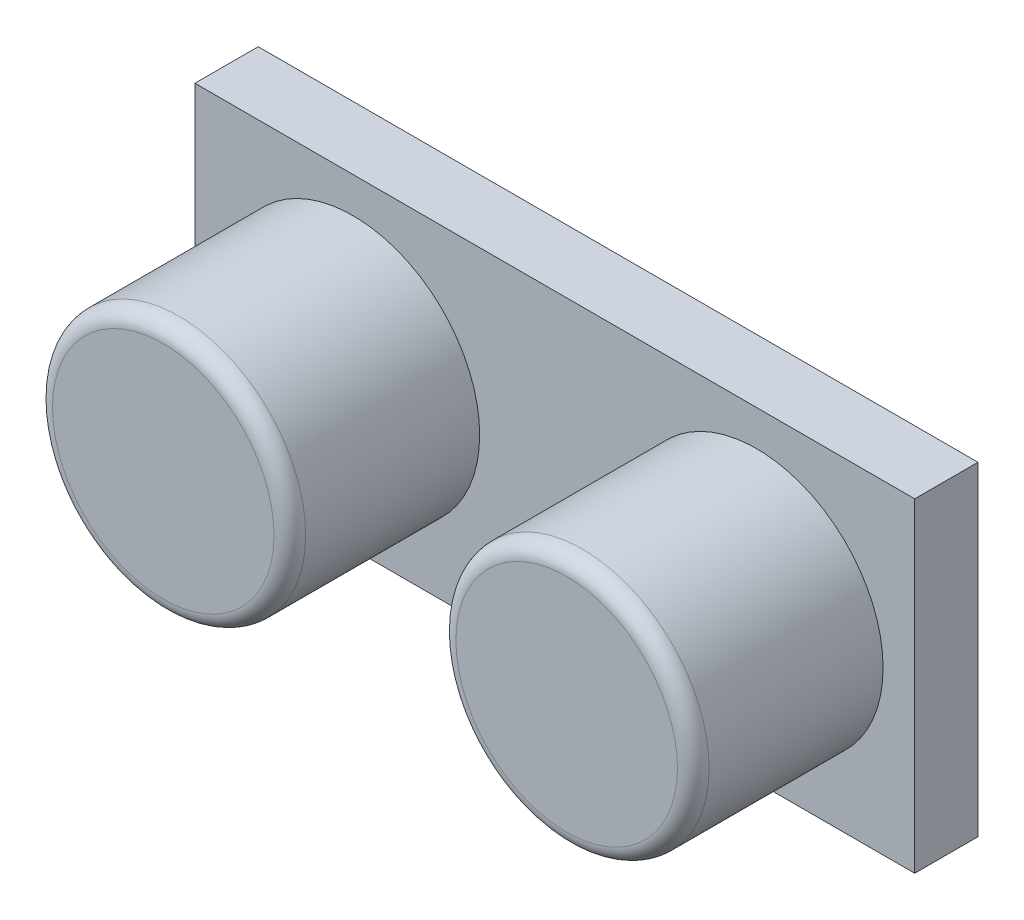
ISO-10303-21;
HEADER;
FILE_DESCRIPTION(('STEP AP214'),'2;1');
FILE_NAME('part.step','',(''),(''),'','','');
FILE_SCHEMA(('AUTOMOTIVE_DESIGN { 1 0 10303 214 1 1 1 1 }'));
ENDSEC;
DATA;
#1=APPLICATION_CONTEXT('core data for automotive mechanical design processes');
#2=APPLICATION_PROTOCOL_DEFINITION('international standard','automotive_design',2000,#1);
#3=PRODUCT_CONTEXT('',#1,'mechanical');
#4=PRODUCT('Part','Part','',(#3));
#5=PRODUCT_RELATED_PRODUCT_CATEGORY('part','',(#4));
#6=PRODUCT_DEFINITION_FORMATION('','',#4);
#7=PRODUCT_DEFINITION_CONTEXT('part definition',#1,'design');
#8=PRODUCT_DEFINITION('design','',#6,#7);
#9=PRODUCT_DEFINITION_SHAPE('','',#8);
#10=(LENGTH_UNIT() NAMED_UNIT(*) SI_UNIT(.MILLI.,.METRE.));
#11=(NAMED_UNIT(*) PLANE_ANGLE_UNIT() SI_UNIT($,.RADIAN.));
#12=(NAMED_UNIT(*) SI_UNIT($,.STERADIAN.) SOLID_ANGLE_UNIT());
#13=UNCERTAINTY_MEASURE_WITH_UNIT(LENGTH_MEASURE(1.E-05),#10,'distance_accuracy_value','');
#14=(GEOMETRIC_REPRESENTATION_CONTEXT(3) GLOBAL_UNCERTAINTY_ASSIGNED_CONTEXT((#13)) GLOBAL_UNIT_ASSIGNED_CONTEXT((#10,
#11,#12)) REPRESENTATION_CONTEXT('',''));
#15=CARTESIAN_POINT('',(0.,0.,0.));
#16=DIRECTION('',(0.,0.,1.));
#17=DIRECTION('',(1.,0.,0.));
#18=AXIS2_PLACEMENT_3D('',#15,#16,#17);
#19=CARTESIAN_POINT('',(0.,0.,4.));
#20=DIRECTION('',(0.,0.,-1.));
#21=DIRECTION('',(-1.,0.,0.));
#22=AXIS2_PLACEMENT_3D('',#19,#20,#21);
#23=PLANE('',#22);
#24=CARTESIAN_POINT('',(-12.75,0.,4.));
#25=DIRECTION('',(0.,0.,-1.));
#26=DIRECTION('',(-1.,0.,0.));
#27=AXIS2_PLACEMENT_3D('',#24,#25,#26);
#28=CIRCLE('',#27,8.);
#29=CARTESIAN_POINT('',(-20.75,0.,4.));
#30=VERTEX_POINT('',#29);
#31=EDGE_CURVE('E109',#30,#30,#28,.F.);
#32=ORIENTED_EDGE('',*,*,#31,.F.);
#33=EDGE_LOOP('',(#32));
#34=FACE_BOUND('',#33,.T.);
#35=DIRECTION('',(0.,1.,0.));
#36=VECTOR('',#35,1.);
#37=CARTESIAN_POINT('',(22.75,-10.25,4.));
#38=LINE('',#37,#36);
#39=CARTESIAN_POINT('',(22.75,-10.25,4.));
#40=VERTEX_POINT('',#39);
#41=CARTESIAN_POINT('',(22.75,10.25,4.));
#42=VERTEX_POINT('',#41);
#43=EDGE_CURVE('E85',#40,#42,#38,.T.);
#44=ORIENTED_EDGE('',*,*,#43,.T.);
#45=DIRECTION('',(-1.,0.,0.));
#46=VECTOR('',#45,1.);
#47=CARTESIAN_POINT('',(-22.75,10.25,4.));
#48=LINE('',#47,#46);
#49=CARTESIAN_POINT('',(-22.75,10.25,4.));
#50=VERTEX_POINT('',#49);
#51=EDGE_CURVE('E80',#42,#50,#48,.T.);
#52=ORIENTED_EDGE('',*,*,#51,.T.);
#53=DIRECTION('',(0.,-1.,0.));
#54=VECTOR('',#53,1.);
#55=CARTESIAN_POINT('',(-22.75,-10.25,4.));
#56=LINE('',#55,#54);
#57=CARTESIAN_POINT('',(-22.75,-10.25,4.));
#58=VERTEX_POINT('',#57);
#59=EDGE_CURVE('E83',#50,#58,#56,.T.);
#60=ORIENTED_EDGE('',*,*,#59,.T.);
#61=DIRECTION('',(1.,0.,0.));
#62=VECTOR('',#61,1.);
#63=CARTESIAN_POINT('',(-22.75,-10.25,4.));
#64=LINE('',#63,#62);
#65=EDGE_CURVE('E49',#58,#40,#64,.T.);
#66=ORIENTED_EDGE('',*,*,#65,.T.);
#67=EDGE_LOOP('',(#44,#52,#60,#66));
#68=FACE_BOUND('',#67,.T.);
#69=CARTESIAN_POINT('',(12.75,0.,4.));
#70=DIRECTION('',(0.,0.,-1.));
#71=DIRECTION('',(-1.,0.,0.));
#72=AXIS2_PLACEMENT_3D('',#69,#70,#71);
#73=CIRCLE('',#72,8.);
#74=CARTESIAN_POINT('',(4.75,0.,4.));
#75=VERTEX_POINT('',#74);
#76=EDGE_CURVE('E112',#75,#75,#73,.F.);
#77=ORIENTED_EDGE('',*,*,#76,.F.);
#78=EDGE_LOOP('',(#77));
#79=FACE_BOUND('',#78,.T.);
#80=ADVANCED_FACE('F32',(#34,#68,#79),#23,.F.);
#81=CARTESIAN_POINT('',(22.75,-10.25,4.));
#82=DIRECTION('',(-1.,0.,0.));
#83=DIRECTION('',(0.,0.,1.));
#84=AXIS2_PLACEMENT_3D('',#81,#82,#83);
#85=PLANE('',#84);
#86=DIRECTION('',(0.,1.,0.));
#87=VECTOR('',#86,1.);
#88=CARTESIAN_POINT('',(22.75,-10.25,0.));
#89=LINE('',#88,#87);
#90=CARTESIAN_POINT('',(22.75,-10.25,0.));
#91=VERTEX_POINT('',#90);
#92=CARTESIAN_POINT('',(22.75,10.25,0.));
#93=VERTEX_POINT('',#92);
#94=EDGE_CURVE('E100',#91,#93,#89,.T.);
#95=ORIENTED_EDGE('',*,*,#94,.T.);
#96=DIRECTION('',(0.,0.,-1.));
#97=VECTOR('',#96,1.);
#98=CARTESIAN_POINT('',(22.75,10.25,4.));
#99=LINE('',#98,#97);
#100=EDGE_CURVE('E91',#42,#93,#99,.T.);
#101=ORIENTED_EDGE('',*,*,#100,.F.);
#102=ORIENTED_EDGE('',*,*,#43,.F.);
#103=DIRECTION('',(0.,0.,-1.));
#104=VECTOR('',#103,1.);
#105=CARTESIAN_POINT('',(22.75,-10.25,4.));
#106=LINE('',#105,#104);
#107=EDGE_CURVE('E96',#40,#91,#106,.T.);
#108=ORIENTED_EDGE('',*,*,#107,.T.);
#109=EDGE_LOOP('',(#95,#101,#102,#108));
#110=FACE_BOUND('',#109,.T.);
#111=ADVANCED_FACE('F135',(#110),#85,.F.);
#112=CARTESIAN_POINT('',(-22.75,10.25,4.));
#113=DIRECTION('',(0.,-1.,0.));
#114=DIRECTION('',(0.,0.,-1.));
#115=AXIS2_PLACEMENT_3D('',#112,#113,#114);
#116=PLANE('',#115);
#117=DIRECTION('',(-1.,0.,0.));
#118=VECTOR('',#117,1.);
#119=CARTESIAN_POINT('',(-22.75,10.25,0.));
#120=LINE('',#119,#118);
#121=CARTESIAN_POINT('',(-22.75,10.25,0.));
#122=VERTEX_POINT('',#121);
#123=EDGE_CURVE('E90',#93,#122,#120,.T.);
#124=ORIENTED_EDGE('',*,*,#123,.T.);
#125=DIRECTION('',(0.,0.,-1.));
#126=VECTOR('',#125,1.);
#127=CARTESIAN_POINT('',(-22.75,10.25,4.));
#128=LINE('',#127,#126);
#129=EDGE_CURVE('E88',#50,#122,#128,.T.);
#130=ORIENTED_EDGE('',*,*,#129,.F.);
#131=ORIENTED_EDGE('',*,*,#51,.F.);
#132=ORIENTED_EDGE('',*,*,#100,.T.);
#133=EDGE_LOOP('',(#124,#130,#131,#132));
#134=FACE_BOUND('',#133,.T.);
#135=ADVANCED_FACE('F89',(#134),#116,.F.);
#136=CARTESIAN_POINT('',(-22.75,-10.25,4.));
#137=DIRECTION('',(1.,0.,0.));
#138=DIRECTION('',(0.,0.,-1.));
#139=AXIS2_PLACEMENT_3D('',#136,#137,#138);
#140=PLANE('',#139);
#141=DIRECTION('',(0.,-1.,0.));
#142=VECTOR('',#141,1.);
#143=CARTESIAN_POINT('',(-22.75,-10.25,0.));
#144=LINE('',#143,#142);
#145=CARTESIAN_POINT('',(-22.75,-10.25,0.));
#146=VERTEX_POINT('',#145);
#147=EDGE_CURVE('E66',#122,#146,#144,.T.);
#148=ORIENTED_EDGE('',*,*,#147,.T.);
#149=DIRECTION('',(0.,0.,-1.));
#150=VECTOR('',#149,1.);
#151=CARTESIAN_POINT('',(-22.75,-10.25,4.));
#152=LINE('',#151,#150);
#153=EDGE_CURVE('E92',#58,#146,#152,.T.);
#154=ORIENTED_EDGE('',*,*,#153,.F.);
#155=ORIENTED_EDGE('',*,*,#59,.F.);
#156=ORIENTED_EDGE('',*,*,#129,.T.);
#157=EDGE_LOOP('',(#148,#154,#155,#156));
#158=FACE_BOUND('',#157,.T.);
#159=ADVANCED_FACE('F94',(#158),#140,.F.);
#160=CARTESIAN_POINT('',(-22.75,-10.25,4.));
#161=DIRECTION('',(0.,1.,0.));
#162=DIRECTION('',(0.,0.,1.));
#163=AXIS2_PLACEMENT_3D('',#160,#161,#162);
#164=PLANE('',#163);
#165=DIRECTION('',(1.,0.,0.));
#166=VECTOR('',#165,1.);
#167=CARTESIAN_POINT('',(-22.75,-10.25,0.));
#168=LINE('',#167,#166);
#169=EDGE_CURVE('E72',#146,#91,#168,.T.);
#170=ORIENTED_EDGE('',*,*,#169,.T.);
#171=ORIENTED_EDGE('',*,*,#107,.F.);
#172=ORIENTED_EDGE('',*,*,#65,.F.);
#173=ORIENTED_EDGE('',*,*,#153,.T.);
#174=EDGE_LOOP('',(#170,#171,#172,#173));
#175=FACE_BOUND('',#174,.T.);
#176=ADVANCED_FACE('F151',(#175),#164,.F.);
#177=CARTESIAN_POINT('',(0.,0.,0.));
#178=DIRECTION('',(0.,0.,-1.));
#179=DIRECTION('',(-1.,0.,0.));
#180=AXIS2_PLACEMENT_3D('',#177,#178,#179);
#181=PLANE('',#180);
#182=ORIENTED_EDGE('',*,*,#94,.F.);
#183=ORIENTED_EDGE('',*,*,#169,.F.);
#184=ORIENTED_EDGE('',*,*,#147,.F.);
#185=ORIENTED_EDGE('',*,*,#123,.F.);
#186=EDGE_LOOP('',(#182,#183,#184,#185));
#187=FACE_BOUND('',#186,.T.);
#188=ADVANCED_FACE('F148',(#187),#181,.T.);
#189=CARTESIAN_POINT('',(-12.75,0.,16.));
#190=DIRECTION('',(0.,0.,-1.));
#191=DIRECTION('',(-1.,0.,0.));
#192=AXIS2_PLACEMENT_3D('',#189,#190,#191);
#193=CYLINDRICAL_SURFACE('',#192,8.);
#194=CARTESIAN_POINT('',(-12.75,0.,15.));
#195=DIRECTION('',(0.,0.,1.));
#196=DIRECTION('',(1.,0.,0.));
#197=AXIS2_PLACEMENT_3D('',#194,#195,#196);
#198=CIRCLE('',#197,8.);
#199=CARTESIAN_POINT('',(-4.75,0.,15.));
#200=VERTEX_POINT('',#199);
#201=EDGE_CURVE('E11',#200,#200,#198,.F.);
#202=ORIENTED_EDGE('',*,*,#201,.T.);
#203=EDGE_LOOP('',(#202));
#204=FACE_BOUND('',#203,.T.);
#205=ORIENTED_EDGE('',*,*,#31,.T.);
#206=EDGE_LOOP('',(#205));
#207=FACE_BOUND('',#206,.T.);
#208=ADVANCED_FACE('F146',(#204,#207),#193,.T.);
#209=CARTESIAN_POINT('',(-12.75,0.,16.));
#210=DIRECTION('',(0.,0.,1.));
#211=DIRECTION('',(1.,0.,0.));
#212=AXIS2_PLACEMENT_3D('',#209,#210,#211);
#213=PLANE('',#212);
#214=CARTESIAN_POINT('',(-12.75,0.,16.));
#215=DIRECTION('',(0.,0.,1.));
#216=DIRECTION('',(1.,0.,0.));
#217=AXIS2_PLACEMENT_3D('',#214,#215,#216);
#218=CIRCLE('',#217,7.);
#219=CARTESIAN_POINT('',(-5.75,0.,16.));
#220=VERTEX_POINT('',#219);
#221=EDGE_CURVE('E41',#220,#220,#218,.T.);
#222=ORIENTED_EDGE('',*,*,#221,.T.);
#223=EDGE_LOOP('',(#222));
#224=FACE_BOUND('',#223,.T.);
#225=ADVANCED_FACE('F123',(#224),#213,.T.);
#226=CARTESIAN_POINT('',(12.75,0.,16.));
#227=DIRECTION('',(0.,0.,-1.));
#228=DIRECTION('',(-1.,0.,0.));
#229=AXIS2_PLACEMENT_3D('',#226,#227,#228);
#230=CYLINDRICAL_SURFACE('',#229,8.);
#231=CARTESIAN_POINT('',(12.75,0.,15.));
#232=DIRECTION('',(0.,0.,1.));
#233=DIRECTION('',(1.,0.,0.));
#234=AXIS2_PLACEMENT_3D('',#231,#232,#233);
#235=CIRCLE('',#234,8.);
#236=CARTESIAN_POINT('',(20.75,0.,15.));
#237=VERTEX_POINT('',#236);
#238=EDGE_CURVE('E118',#237,#237,#235,.F.);
#239=ORIENTED_EDGE('',*,*,#238,.T.);
#240=EDGE_LOOP('',(#239));
#241=FACE_BOUND('',#240,.T.);
#242=ORIENTED_EDGE('',*,*,#76,.T.);
#243=EDGE_LOOP('',(#242));
#244=FACE_BOUND('',#243,.T.);
#245=ADVANCED_FACE('F190',(#241,#244),#230,.T.);
#246=CARTESIAN_POINT('',(12.75,0.,16.));
#247=DIRECTION('',(0.,0.,1.));
#248=DIRECTION('',(1.,0.,0.));
#249=AXIS2_PLACEMENT_3D('',#246,#247,#248);
#250=PLANE('',#249);
#251=CARTESIAN_POINT('',(12.75,0.,16.));
#252=DIRECTION('',(0.,0.,1.));
#253=DIRECTION('',(1.,0.,0.));
#254=AXIS2_PLACEMENT_3D('',#251,#252,#253);
#255=CIRCLE('',#254,7.);
#256=CARTESIAN_POINT('',(19.75,0.,16.));
#257=VERTEX_POINT('',#256);
#258=EDGE_CURVE('E115',#257,#257,#255,.T.);
#259=ORIENTED_EDGE('',*,*,#258,.T.);
#260=EDGE_LOOP('',(#259));
#261=FACE_BOUND('',#260,.T.);
#262=ADVANCED_FACE('F131',(#261),#250,.T.);
#263=CARTESIAN_POINT('',(12.75,0.,15.));
#264=DIRECTION('',(0.,0.,1.));
#265=DIRECTION('',(1.,0.,0.));
#266=AXIS2_PLACEMENT_3D('',#263,#264,#265);
#267=TOROIDAL_SURFACE('',#266,7.,1.);
#268=ORIENTED_EDGE('',*,*,#238,.F.);
#269=EDGE_LOOP('',(#268));
#270=FACE_BOUND('',#269,.T.);
#271=ORIENTED_EDGE('',*,*,#258,.F.);
#272=EDGE_LOOP('',(#271));
#273=FACE_BOUND('',#272,.T.);
#274=ADVANCED_FACE('F126',(#270,#273),#267,.T.);
#275=CARTESIAN_POINT('',(-12.75,0.,15.));
#276=DIRECTION('',(0.,0.,1.));
#277=DIRECTION('',(1.,0.,0.));
#278=AXIS2_PLACEMENT_3D('',#275,#276,#277);
#279=TOROIDAL_SURFACE('',#278,7.,1.);
#280=ORIENTED_EDGE('',*,*,#201,.F.);
#281=EDGE_LOOP('',(#280));
#282=FACE_BOUND('',#281,.T.);
#283=ORIENTED_EDGE('',*,*,#221,.F.);
#284=EDGE_LOOP('',(#283));
#285=FACE_BOUND('',#284,.T.);
#286=ADVANCED_FACE('F34',(#282,#285),#279,.T.);
#287=CLOSED_SHELL('',(#80,#111,#135,#159,#176,#188,#208,#225,#245,#262,#274,#286));
#288=MANIFOLD_SOLID_BREP('B2',#287);
#289=ADVANCED_BREP_SHAPE_REPRESENTATION('',(#18,#288),#14);
#290=SHAPE_DEFINITION_REPRESENTATION(#9,#289);
ENDSEC;
END-ISO-10303-21;
